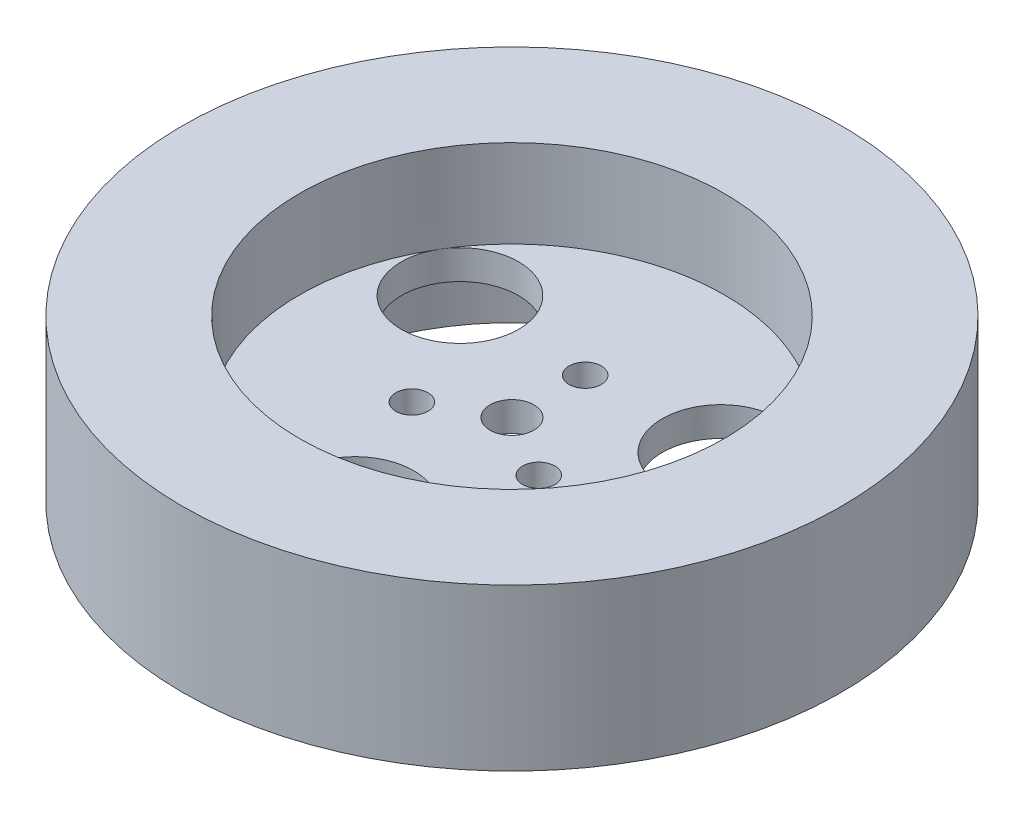
ISO-10303-21;
HEADER;
FILE_DESCRIPTION(('STEP AP214'),'2;1');
FILE_NAME('part.step','',(''),(''),'','','');
FILE_SCHEMA(('AUTOMOTIVE_DESIGN { 1 0 10303 214 1 1 1 1 }'));
ENDSEC;
DATA;
#1=APPLICATION_CONTEXT('core data for automotive mechanical design processes');
#2=APPLICATION_PROTOCOL_DEFINITION('international standard','automotive_design',2000,#1);
#3=PRODUCT_CONTEXT('',#1,'mechanical');
#4=PRODUCT('Part','Part','',(#3));
#5=PRODUCT_RELATED_PRODUCT_CATEGORY('part','',(#4));
#6=PRODUCT_DEFINITION_FORMATION('','',#4);
#7=PRODUCT_DEFINITION_CONTEXT('part definition',#1,'design');
#8=PRODUCT_DEFINITION('design','',#6,#7);
#9=PRODUCT_DEFINITION_SHAPE('','',#8);
#10=(LENGTH_UNIT() NAMED_UNIT(*) SI_UNIT(.MILLI.,.METRE.));
#11=(NAMED_UNIT(*) PLANE_ANGLE_UNIT() SI_UNIT($,.RADIAN.));
#12=(NAMED_UNIT(*) SI_UNIT($,.STERADIAN.) SOLID_ANGLE_UNIT());
#13=UNCERTAINTY_MEASURE_WITH_UNIT(LENGTH_MEASURE(1.E-05),#10,'distance_accuracy_value','');
#14=(GEOMETRIC_REPRESENTATION_CONTEXT(3) GLOBAL_UNCERTAINTY_ASSIGNED_CONTEXT((#13)) GLOBAL_UNIT_ASSIGNED_CONTEXT((#10,
#11,#12)) REPRESENTATION_CONTEXT('',''));
#15=CARTESIAN_POINT('',(0.,0.,0.));
#16=DIRECTION('',(0.,0.,1.));
#17=DIRECTION('',(1.,0.,0.));
#18=AXIS2_PLACEMENT_3D('',#15,#16,#17);
#19=CARTESIAN_POINT('',(0.,11.,0.));
#20=DIRECTION('',(0.,-1.,0.));
#21=DIRECTION('',(0.,0.,-1.));
#22=AXIS2_PLACEMENT_3D('',#19,#20,#21);
#23=CYLINDRICAL_SURFACE('',#22,22.5);
#24=CARTESIAN_POINT('',(0.,11.,0.));
#25=DIRECTION('',(0.,1.,0.));
#26=DIRECTION('',(0.,0.,1.));
#27=AXIS2_PLACEMENT_3D('',#24,#25,#26);
#28=CIRCLE('',#27,22.5);
#29=CARTESIAN_POINT('',(0.,11.,22.5));
#30=VERTEX_POINT('',#29);
#31=EDGE_CURVE('E11',#30,#30,#28,.T.);
#32=ORIENTED_EDGE('',*,*,#31,.F.);
#33=EDGE_LOOP('',(#32));
#34=FACE_BOUND('',#33,.T.);
#35=CARTESIAN_POINT('',(0.,0.,0.));
#36=DIRECTION('',(0.,1.,0.));
#37=DIRECTION('',(0.,0.,1.));
#38=AXIS2_PLACEMENT_3D('',#35,#36,#37);
#39=CIRCLE('',#38,22.5);
#40=CARTESIAN_POINT('',(0.,0.,22.5));
#41=VERTEX_POINT('',#40);
#42=EDGE_CURVE('E48',#41,#41,#39,.T.);
#43=ORIENTED_EDGE('',*,*,#42,.T.);
#44=EDGE_LOOP('',(#43));
#45=FACE_BOUND('',#44,.T.);
#46=ADVANCED_FACE('F45',(#34,#45),#23,.T.);
#47=CARTESIAN_POINT('',(0.,11.,0.));
#48=DIRECTION('',(0.,1.,0.));
#49=DIRECTION('',(0.,0.,1.));
#50=AXIS2_PLACEMENT_3D('',#47,#48,#49);
#51=PLANE('',#50);
#52=CARTESIAN_POINT('',(0.,11.,0.));
#53=DIRECTION('',(0.,1.,0.));
#54=DIRECTION('',(0.,0.,1.));
#55=AXIS2_PLACEMENT_3D('',#52,#53,#54);
#56=CIRCLE('',#55,14.5);
#57=CARTESIAN_POINT('',(0.,11.,14.5));
#58=VERTEX_POINT('',#57);
#59=EDGE_CURVE('E90',#58,#58,#56,.T.);
#60=ORIENTED_EDGE('',*,*,#59,.F.);
#61=EDGE_LOOP('',(#60));
#62=FACE_BOUND('',#61,.T.);
#63=ORIENTED_EDGE('',*,*,#31,.T.);
#64=EDGE_LOOP('',(#63));
#65=FACE_BOUND('',#64,.T.);
#66=ADVANCED_FACE('F121',(#62,#65),#51,.T.);
#67=CARTESIAN_POINT('',(0.,0.,0.));
#68=DIRECTION('',(0.,1.,0.));
#69=DIRECTION('',(0.,0.,1.));
#70=AXIS2_PLACEMENT_3D('',#67,#68,#69);
#71=PLANE('',#70);
#72=CARTESIAN_POINT('',(0.,0.,0.));
#73=DIRECTION('',(0.,-1.,0.));
#74=DIRECTION('',(0.,0.,-1.));
#75=AXIS2_PLACEMENT_3D('',#72,#73,#74);
#76=CIRCLE('',#75,15.);
#77=CARTESIAN_POINT('',(0.,0.,-15.));
#78=VERTEX_POINT('',#77);
#79=EDGE_CURVE('E74',#78,#78,#76,.T.);
#80=ORIENTED_EDGE('',*,*,#79,.F.);
#81=EDGE_LOOP('',(#80));
#82=FACE_BOUND('',#81,.T.);
#83=ORIENTED_EDGE('',*,*,#42,.F.);
#84=EDGE_LOOP('',(#83));
#85=FACE_BOUND('',#84,.T.);
#86=ADVANCED_FACE('F111',(#82,#85),#71,.F.);
#87=CARTESIAN_POINT('',(0.,5.,0.));
#88=DIRECTION('',(0.,1.,0.));
#89=DIRECTION('',(0.,0.,1.));
#90=AXIS2_PLACEMENT_3D('',#87,#88,#89);
#91=CYLINDRICAL_SURFACE('',#90,14.5);
#92=CARTESIAN_POINT('',(0.,5.,0.));
#93=DIRECTION('',(0.,1.,0.));
#94=DIRECTION('',(0.,0.,1.));
#95=AXIS2_PLACEMENT_3D('',#92,#93,#94);
#96=CIRCLE('',#95,14.5);
#97=CARTESIAN_POINT('',(12.7030438506053,5.,-6.99161475838013));
#98=VERTEX_POINT('',#97);
#99=CARTESIAN_POINT('',(-12.4064379195344,5.,-7.50535130082129));
#100=VERTEX_POINT('',#99);
#101=EDGE_CURVE('E92',#98,#100,#96,.T.);
#102=ORIENTED_EDGE('',*,*,#101,.F.);
#103=CARTESIAN_POINT('',(-0.29660593107066,5.,14.496966059202));
#104=VERTEX_POINT('',#103);
#105=EDGE_CURVE('E96',#104,#98,#96,.T.);
#106=ORIENTED_EDGE('',*,*,#105,.F.);
#107=EDGE_CURVE('E95',#100,#104,#96,.T.);
#108=ORIENTED_EDGE('',*,*,#107,.F.);
#109=EDGE_LOOP('',(#102,#106,#108));
#110=FACE_BOUND('',#109,.T.);
#111=ORIENTED_EDGE('',*,*,#59,.T.);
#112=EDGE_LOOP('',(#111));
#113=FACE_BOUND('',#112,.T.);
#114=ADVANCED_FACE('F109',(#110,#113),#91,.F.);
#115=CARTESIAN_POINT('',(0.,5.,0.));
#116=DIRECTION('',(0.,1.,0.));
#117=DIRECTION('',(0.,0.,1.));
#118=AXIS2_PLACEMENT_3D('',#115,#116,#117);
#119=PLANE('',#118);
#120=CARTESIAN_POINT('',(-4.33012701892195,5.,2.50000000000014));
#121=DIRECTION('',(0.,1.,0.));
#122=DIRECTION('',(0.,0.,1.));
#123=AXIS2_PLACEMENT_3D('',#120,#121,#122);
#124=CIRCLE('',#123,1.1);
#125=CARTESIAN_POINT('',(-4.33012701892195,5.,3.60000000000014));
#126=VERTEX_POINT('',#125);
#127=EDGE_CURVE('E244',#126,#126,#124,.T.);
#128=ORIENTED_EDGE('',*,*,#127,.F.);
#129=EDGE_LOOP('',(#128));
#130=FACE_BOUND('',#129,.T.);
#131=CARTESIAN_POINT('',(0.,5.,0.));
#132=DIRECTION('',(0.,1.,0.));
#133=DIRECTION('',(0.,0.,1.));
#134=AXIS2_PLACEMENT_3D('',#131,#132,#133);
#135=CIRCLE('',#134,1.5);
#136=CARTESIAN_POINT('',(0.,5.,1.5));
#137=VERTEX_POINT('',#136);
#138=EDGE_CURVE('E250',#137,#137,#135,.T.);
#139=ORIENTED_EDGE('',*,*,#138,.F.);
#140=EDGE_LOOP('',(#139));
#141=FACE_BOUND('',#140,.T.);
#142=CARTESIAN_POINT('',(4.33012701892244,5.,2.49999999999986));
#143=DIRECTION('',(0.,1.,0.));
#144=DIRECTION('',(0.,0.,1.));
#145=AXIS2_PLACEMENT_3D('',#142,#143,#144);
#146=CIRCLE('',#145,1.1);
#147=CARTESIAN_POINT('',(4.33012701892244,5.,3.59999999999986));
#148=VERTEX_POINT('',#147);
#149=EDGE_CURVE('E253',#148,#148,#146,.T.);
#150=ORIENTED_EDGE('',*,*,#149,.F.);
#151=EDGE_LOOP('',(#150));
#152=FACE_BOUND('',#151,.T.);
#153=CARTESIAN_POINT('',(0.,5.,-5.));
#154=DIRECTION('',(0.,1.,0.));
#155=DIRECTION('',(0.,0.,1.));
#156=AXIS2_PLACEMENT_3D('',#153,#154,#155);
#157=CIRCLE('',#156,1.1);
#158=CARTESIAN_POINT('',(0.,5.,-3.9));
#159=VERTEX_POINT('',#158);
#160=EDGE_CURVE('E276',#159,#159,#157,.T.);
#161=ORIENTED_EDGE('',*,*,#160,.F.);
#162=EDGE_LOOP('',(#161));
#163=FACE_BOUND('',#162,.T.);
#164=ORIENTED_EDGE('',*,*,#107,.T.);
#165=CARTESIAN_POINT('',(-0.21478360525807,5.,10.4978030083879));
#166=DIRECTION('',(0.,1.,0.));
#167=DIRECTION('',(0.,0.,1.));
#168=AXIS2_PLACEMENT_3D('',#165,#166,#167);
#169=CIRCLE('',#168,4.);
#170=EDGE_CURVE('E58',#104,#104,#169,.T.);
#171=ORIENTED_EDGE('',*,*,#170,.F.);
#172=ORIENTED_EDGE('',*,*,#105,.T.);
#173=CARTESIAN_POINT('',(9.19875589181763,5.,-5.06289344572354));
#174=DIRECTION('',(0.,1.,0.));
#175=DIRECTION('',(0.,0.,1.));
#176=AXIS2_PLACEMENT_3D('',#173,#174,#175);
#177=CIRCLE('',#176,4.);
#178=EDGE_CURVE('E68',#98,#98,#177,.T.);
#179=ORIENTED_EDGE('',*,*,#178,.F.);
#180=ORIENTED_EDGE('',*,*,#101,.T.);
#181=CARTESIAN_POINT('',(-8.98397228655916,5.,-5.43490956266357));
#182=DIRECTION('',(0.,1.,0.));
#183=DIRECTION('',(0.,0.,1.));
#184=AXIS2_PLACEMENT_3D('',#181,#182,#183);
#185=CIRCLE('',#184,4.);
#186=EDGE_CURVE('E63',#100,#100,#185,.T.);
#187=ORIENTED_EDGE('',*,*,#186,.F.);
#188=EDGE_LOOP('',(#164,#171,#172,#179,#180,#187));
#189=FACE_BOUND('',#188,.T.);
#190=ADVANCED_FACE('F107',(#130,#141,#152,#163,#189),#119,.T.);
#191=CARTESIAN_POINT('',(0.,3.,0.));
#192=DIRECTION('',(0.,-1.,0.));
#193=DIRECTION('',(0.,0.,-1.));
#194=AXIS2_PLACEMENT_3D('',#191,#192,#193);
#195=CYLINDRICAL_SURFACE('',#194,15.);
#196=CARTESIAN_POINT('',(0.,3.,0.));
#197=DIRECTION('',(0.,-1.,0.));
#198=DIRECTION('',(0.,0.,-1.));
#199=AXIS2_PLACEMENT_3D('',#196,#197,#198);
#200=CIRCLE('',#199,15.);
#201=CARTESIAN_POINT('',(0.,3.,-15.));
#202=VERTEX_POINT('',#201);
#203=EDGE_CURVE('E80',#202,#202,#200,.T.);
#204=ORIENTED_EDGE('',*,*,#203,.F.);
#205=EDGE_LOOP('',(#204));
#206=FACE_BOUND('',#205,.T.);
#207=ORIENTED_EDGE('',*,*,#79,.T.);
#208=EDGE_LOOP('',(#207));
#209=FACE_BOUND('',#208,.T.);
#210=ADVANCED_FACE('F117',(#206,#209),#195,.F.);
#211=CARTESIAN_POINT('',(0.,3.,0.));
#212=DIRECTION('',(0.,-1.,0.));
#213=DIRECTION('',(0.,0.,-1.));
#214=AXIS2_PLACEMENT_3D('',#211,#212,#213);
#215=PLANE('',#214);
#216=CARTESIAN_POINT('',(-4.33012701892195,3.,2.50000000000014));
#217=DIRECTION('',(0.,-1.,0.));
#218=DIRECTION('',(0.,0.,-1.));
#219=AXIS2_PLACEMENT_3D('',#216,#217,#218);
#220=CIRCLE('',#219,1.1);
#221=CARTESIAN_POINT('',(-4.33012701892195,3.,1.40000000000014));
#222=VERTEX_POINT('',#221);
#223=EDGE_CURVE('E241',#222,#222,#220,.F.);
#224=ORIENTED_EDGE('',*,*,#223,.T.);
#225=EDGE_LOOP('',(#224));
#226=FACE_BOUND('',#225,.T.);
#227=CARTESIAN_POINT('',(0.,3.,0.));
#228=DIRECTION('',(0.,-1.,0.));
#229=DIRECTION('',(0.,0.,-1.));
#230=AXIS2_PLACEMENT_3D('',#227,#228,#229);
#231=CIRCLE('',#230,1.5);
#232=CARTESIAN_POINT('',(0.,3.,-1.5));
#233=VERTEX_POINT('',#232);
#234=EDGE_CURVE('E267',#233,#233,#231,.F.);
#235=ORIENTED_EDGE('',*,*,#234,.T.);
#236=EDGE_LOOP('',(#235));
#237=FACE_BOUND('',#236,.T.);
#238=CARTESIAN_POINT('',(-0.21478360525807,3.,10.4978030083879));
#239=DIRECTION('',(0.,-1.,0.));
#240=DIRECTION('',(0.,0.,-1.));
#241=AXIS2_PLACEMENT_3D('',#238,#239,#240);
#242=CIRCLE('',#241,4.);
#243=CARTESIAN_POINT('',(-0.21478360525807,3.,6.4978030083879));
#244=VERTEX_POINT('',#243);
#245=EDGE_CURVE('E261',#244,#244,#242,.F.);
#246=ORIENTED_EDGE('',*,*,#245,.T.);
#247=EDGE_LOOP('',(#246));
#248=FACE_BOUND('',#247,.T.);
#249=CARTESIAN_POINT('',(-8.98397228655916,3.,-5.43490956266357));
#250=DIRECTION('',(0.,-1.,0.));
#251=DIRECTION('',(0.,0.,-1.));
#252=AXIS2_PLACEMENT_3D('',#249,#250,#251);
#253=CIRCLE('',#252,4.);
#254=CARTESIAN_POINT('',(-8.98397228655916,3.,-9.43490956266357));
#255=VERTEX_POINT('',#254);
#256=EDGE_CURVE('E83',#255,#255,#253,.F.);
#257=ORIENTED_EDGE('',*,*,#256,.T.);
#258=EDGE_LOOP('',(#257));
#259=FACE_BOUND('',#258,.T.);
#260=CARTESIAN_POINT('',(4.33012701892244,3.,2.49999999999986));
#261=DIRECTION('',(0.,-1.,0.));
#262=DIRECTION('',(0.,0.,-1.));
#263=AXIS2_PLACEMENT_3D('',#260,#261,#262);
#264=CIRCLE('',#263,1.1);
#265=CARTESIAN_POINT('',(4.33012701892244,3.,1.39999999999986));
#266=VERTEX_POINT('',#265);
#267=EDGE_CURVE('E246',#266,#266,#264,.F.);
#268=ORIENTED_EDGE('',*,*,#267,.T.);
#269=EDGE_LOOP('',(#268));
#270=FACE_BOUND('',#269,.T.);
#271=CARTESIAN_POINT('',(0.,3.,-5.));
#272=DIRECTION('',(0.,-1.,0.));
#273=DIRECTION('',(0.,0.,-1.));
#274=AXIS2_PLACEMENT_3D('',#271,#272,#273);
#275=CIRCLE('',#274,1.1);
#276=CARTESIAN_POINT('',(0.,3.,-6.1));
#277=VERTEX_POINT('',#276);
#278=EDGE_CURVE('E280',#277,#277,#275,.F.);
#279=ORIENTED_EDGE('',*,*,#278,.T.);
#280=EDGE_LOOP('',(#279));
#281=FACE_BOUND('',#280,.T.);
#282=CARTESIAN_POINT('',(9.19875589181763,3.,-5.06289344572354));
#283=DIRECTION('',(0.,-1.,0.));
#284=DIRECTION('',(0.,0.,-1.));
#285=AXIS2_PLACEMENT_3D('',#282,#283,#284);
#286=CIRCLE('',#285,4.);
#287=CARTESIAN_POINT('',(9.19875589181763,3.,-9.06289344572354));
#288=VERTEX_POINT('',#287);
#289=EDGE_CURVE('E75',#288,#288,#286,.F.);
#290=ORIENTED_EDGE('',*,*,#289,.T.);
#291=EDGE_LOOP('',(#290));
#292=FACE_BOUND('',#291,.T.);
#293=ORIENTED_EDGE('',*,*,#203,.T.);
#294=EDGE_LOOP('',(#293));
#295=FACE_BOUND('',#294,.T.);
#296=ADVANCED_FACE('F149',(#226,#237,#248,#259,#270,#281,#292,#295),#215,.T.);
#297=CARTESIAN_POINT('',(9.19875589181763,-0.00100000000000013,-5.06289344572354));
#298=DIRECTION('',(0.,1.,0.));
#299=DIRECTION('',(0.,0.,1.));
#300=AXIS2_PLACEMENT_3D('',#297,#298,#299);
#301=CYLINDRICAL_SURFACE('',#300,4.);
#302=ORIENTED_EDGE('',*,*,#289,.F.);
#303=EDGE_LOOP('',(#302));
#304=FACE_BOUND('',#303,.T.);
#305=ORIENTED_EDGE('',*,*,#178,.T.);
#306=EDGE_LOOP('',(#305));
#307=FACE_BOUND('',#306,.T.);
#308=ADVANCED_FACE('F69',(#304,#307),#301,.F.);
#309=CARTESIAN_POINT('',(0.,-0.00100000000000013,-5.));
#310=DIRECTION('',(0.,1.,0.));
#311=DIRECTION('',(0.,0.,1.));
#312=AXIS2_PLACEMENT_3D('',#309,#310,#311);
#313=CYLINDRICAL_SURFACE('',#312,1.1);
#314=ORIENTED_EDGE('',*,*,#278,.F.);
#315=EDGE_LOOP('',(#314));
#316=FACE_BOUND('',#315,.T.);
#317=ORIENTED_EDGE('',*,*,#160,.T.);
#318=EDGE_LOOP('',(#317));
#319=FACE_BOUND('',#318,.T.);
#320=ADVANCED_FACE('F175',(#316,#319),#313,.F.);
#321=CARTESIAN_POINT('',(4.33012701892244,-0.00100000000000013,2.49999999999986));
#322=DIRECTION('',(0.,1.,0.));
#323=DIRECTION('',(0.,0.,1.));
#324=AXIS2_PLACEMENT_3D('',#321,#322,#323);
#325=CYLINDRICAL_SURFACE('',#324,1.1);
#326=ORIENTED_EDGE('',*,*,#267,.F.);
#327=EDGE_LOOP('',(#326));
#328=FACE_BOUND('',#327,.T.);
#329=ORIENTED_EDGE('',*,*,#149,.T.);
#330=EDGE_LOOP('',(#329));
#331=FACE_BOUND('',#330,.T.);
#332=ADVANCED_FACE('F185',(#328,#331),#325,.F.);
#333=CARTESIAN_POINT('',(-8.98397228655916,-0.00100000000000013,-5.43490956266357));
#334=DIRECTION('',(0.,1.,0.));
#335=DIRECTION('',(0.,0.,1.));
#336=AXIS2_PLACEMENT_3D('',#333,#334,#335);
#337=CYLINDRICAL_SURFACE('',#336,4.);
#338=ORIENTED_EDGE('',*,*,#256,.F.);
#339=EDGE_LOOP('',(#338));
#340=FACE_BOUND('',#339,.T.);
#341=ORIENTED_EDGE('',*,*,#186,.T.);
#342=EDGE_LOOP('',(#341));
#343=FACE_BOUND('',#342,.T.);
#344=ADVANCED_FACE('F195',(#340,#343),#337,.F.);
#345=CARTESIAN_POINT('',(-0.21478360525807,-0.00100000000000013,10.4978030083879));
#346=DIRECTION('',(0.,1.,0.));
#347=DIRECTION('',(0.,0.,1.));
#348=AXIS2_PLACEMENT_3D('',#345,#346,#347);
#349=CYLINDRICAL_SURFACE('',#348,4.);
#350=ORIENTED_EDGE('',*,*,#245,.F.);
#351=EDGE_LOOP('',(#350));
#352=FACE_BOUND('',#351,.T.);
#353=ORIENTED_EDGE('',*,*,#170,.T.);
#354=EDGE_LOOP('',(#353));
#355=FACE_BOUND('',#354,.T.);
#356=ADVANCED_FACE('F205',(#352,#355),#349,.F.);
#357=CARTESIAN_POINT('',(0.,-0.00100000000000013,0.));
#358=DIRECTION('',(0.,1.,0.));
#359=DIRECTION('',(0.,0.,1.));
#360=AXIS2_PLACEMENT_3D('',#357,#358,#359);
#361=CYLINDRICAL_SURFACE('',#360,1.5);
#362=ORIENTED_EDGE('',*,*,#234,.F.);
#363=EDGE_LOOP('',(#362));
#364=FACE_BOUND('',#363,.T.);
#365=ORIENTED_EDGE('',*,*,#138,.T.);
#366=EDGE_LOOP('',(#365));
#367=FACE_BOUND('',#366,.T.);
#368=ADVANCED_FACE('F215',(#364,#367),#361,.F.);
#369=CARTESIAN_POINT('',(-4.33012701892195,-0.00100000000000013,2.50000000000014));
#370=DIRECTION('',(0.,1.,0.));
#371=DIRECTION('',(0.,0.,1.));
#372=AXIS2_PLACEMENT_3D('',#369,#370,#371);
#373=CYLINDRICAL_SURFACE('',#372,1.1);
#374=ORIENTED_EDGE('',*,*,#223,.F.);
#375=EDGE_LOOP('',(#374));
#376=FACE_BOUND('',#375,.T.);
#377=ORIENTED_EDGE('',*,*,#127,.T.);
#378=EDGE_LOOP('',(#377));
#379=FACE_BOUND('',#378,.T.);
#380=ADVANCED_FACE('F225',(#376,#379),#373,.F.);
#381=CLOSED_SHELL('',(#46,#66,#86,#114,#190,#210,#296,#308,#320,#332,#344,#356,#368,#380));
#382=MANIFOLD_SOLID_BREP('B2',#381);
#383=ADVANCED_BREP_SHAPE_REPRESENTATION('',(#18,#382),#14);
#384=SHAPE_DEFINITION_REPRESENTATION(#9,#383);
ENDSEC;
END-ISO-10303-21;
